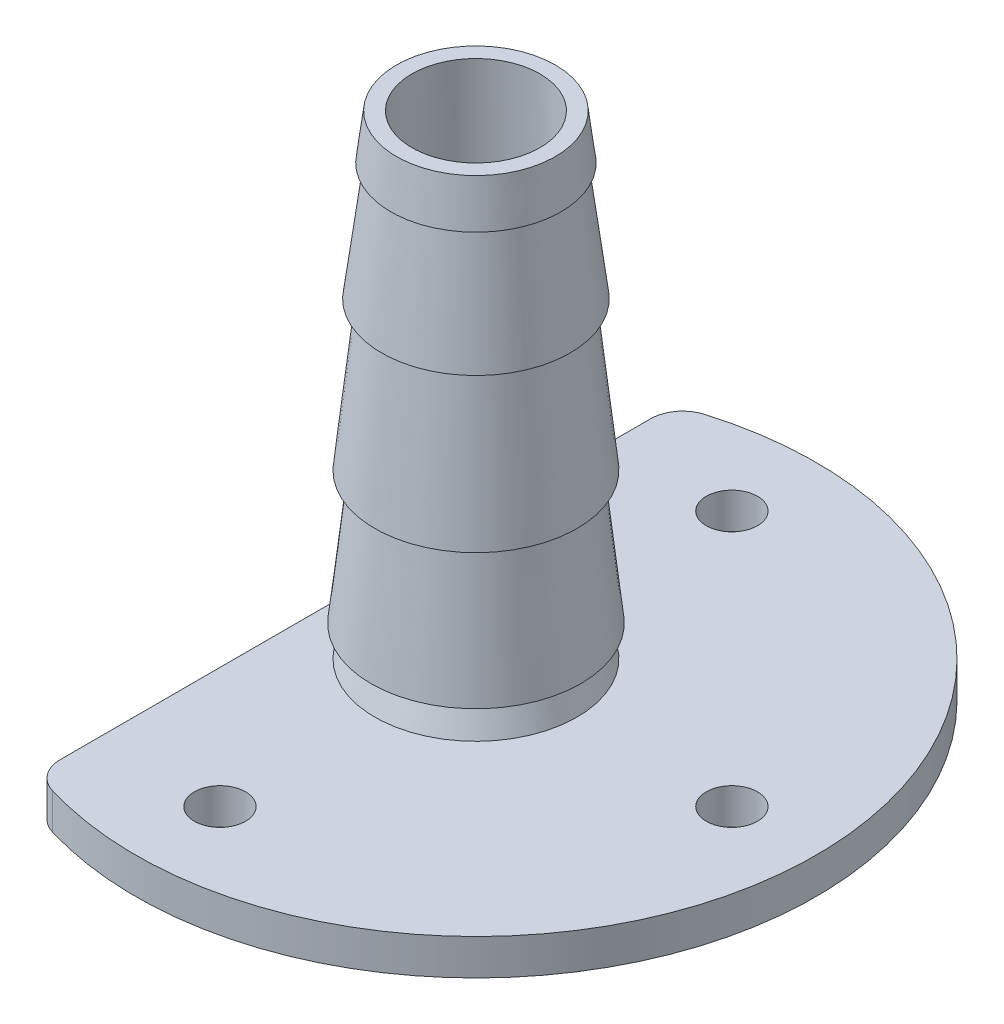
ISO-10303-21;
HEADER;
FILE_DESCRIPTION(('STEP AP214'),'2;1');
FILE_NAME('part.step','',(''),(''),'','','');
FILE_SCHEMA(('AUTOMOTIVE_DESIGN { 1 0 10303 214 1 1 1 1 }'));
ENDSEC;
DATA;
#1=APPLICATION_CONTEXT('core data for automotive mechanical design processes');
#2=APPLICATION_PROTOCOL_DEFINITION('international standard','automotive_design',2000,#1);
#3=PRODUCT_CONTEXT('',#1,'mechanical');
#4=PRODUCT('Part','Part','',(#3));
#5=PRODUCT_RELATED_PRODUCT_CATEGORY('part','',(#4));
#6=PRODUCT_DEFINITION_FORMATION('','',#4);
#7=PRODUCT_DEFINITION_CONTEXT('part definition',#1,'design');
#8=PRODUCT_DEFINITION('design','',#6,#7);
#9=PRODUCT_DEFINITION_SHAPE('','',#8);
#10=(LENGTH_UNIT() NAMED_UNIT(*) SI_UNIT(.MILLI.,.METRE.));
#11=(NAMED_UNIT(*) PLANE_ANGLE_UNIT() SI_UNIT($,.RADIAN.));
#12=(NAMED_UNIT(*) SI_UNIT($,.STERADIAN.) SOLID_ANGLE_UNIT());
#13=UNCERTAINTY_MEASURE_WITH_UNIT(LENGTH_MEASURE(1.E-05),#10,'distance_accuracy_value','');
#14=(GEOMETRIC_REPRESENTATION_CONTEXT(3) GLOBAL_UNCERTAINTY_ASSIGNED_CONTEXT((#13)) GLOBAL_UNIT_ASSIGNED_CONTEXT((#10,
#11,#12)) REPRESENTATION_CONTEXT('',''));
#15=CARTESIAN_POINT('',(0.,0.,0.));
#16=DIRECTION('',(0.,0.,1.));
#17=DIRECTION('',(1.,0.,0.));
#18=AXIS2_PLACEMENT_3D('',#15,#16,#17);
#19=CARTESIAN_POINT('',(0.,2.3212869367093,0.));
#20=DIRECTION('',(0.,-1.,0.));
#21=DIRECTION('',(0.,0.,-1.));
#22=AXIS2_PLACEMENT_3D('',#19,#20,#21);
#23=TOROIDAL_SURFACE('',#22,6.55682740154308,2.);
#24=CARTESIAN_POINT('',(0.,2.28379352676862,0.));
#25=DIRECTION('',(0.,-1.,0.));
#26=DIRECTION('',(0.,0.,-1.));
#27=AXIS2_PLACEMENT_3D('',#24,#25,#26);
#28=CIRCLE('',#27,4.55717887137309);
#29=CARTESIAN_POINT('',(0.,2.28379352676862,-4.55717887137309));
#30=VERTEX_POINT('',#29);
#31=EDGE_CURVE('E124',#30,#30,#28,.T.);
#32=ORIENTED_EDGE('',*,*,#31,.F.);
#33=EDGE_LOOP('',(#32));
#34=FACE_BOUND('',#33,.T.);
#35=CARTESIAN_POINT('',(0.,1.64561350948055,0.));
#36=DIRECTION('',(0.,-1.,0.));
#37=DIRECTION('',(0.,0.,-1.));
#38=AXIS2_PLACEMENT_3D('',#35,#36,#37);
#39=CIRCLE('',#38,4.67441792968609);
#40=CARTESIAN_POINT('',(0.,1.64561350948055,-4.67441792968609));
#41=VERTEX_POINT('',#40);
#42=EDGE_CURVE('E111',#41,#41,#39,.T.);
#43=ORIENTED_EDGE('',*,*,#42,.T.);
#44=EDGE_LOOP('',(#43));
#45=FACE_BOUND('',#44,.T.);
#46=ADVANCED_FACE('F38',(#34,#45),#23,.T.);
#47=CARTESIAN_POINT('',(0.,1.64561350948055,0.));
#48=DIRECTION('',(0.,-1.,0.));
#49=DIRECTION('',(0.,0.,-1.));
#50=AXIS2_PLACEMENT_3D('',#47,#48,#49);
#51=CONICAL_SURFACE('',#50,4.67441792968609,0.344617523861515);
#52=CARTESIAN_POINT('',(0.,0.,0.));
#53=DIRECTION('',(0.,-1.,0.));
#54=DIRECTION('',(0.,0.,-1.));
#55=AXIS2_PLACEMENT_3D('',#52,#53,#54);
#56=CIRCLE('',#55,5.26509564166538);
#57=CARTESIAN_POINT('',(0.,0.,-5.26509564166538));
#58=VERTEX_POINT('',#57);
#59=EDGE_CURVE('E102',#58,#58,#56,.T.);
#60=ORIENTED_EDGE('',*,*,#59,.T.);
#61=EDGE_LOOP('',(#60));
#62=FACE_BOUND('',#61,.T.);
#63=ORIENTED_EDGE('',*,*,#42,.F.);
#64=EDGE_LOOP('',(#63));
#65=FACE_BOUND('',#64,.T.);
#66=ADVANCED_FACE('F242',(#62,#65),#51,.F.);
#67=CARTESIAN_POINT('',(0.,0.,0.));
#68=DIRECTION('',(0.,-1.,0.));
#69=DIRECTION('',(0.,0.,-1.));
#70=AXIS2_PLACEMENT_3D('',#67,#68,#69);
#71=PLANE('',#70);
#72=DIRECTION('',(0.,0.,1.));
#73=VECTOR('',#72,1.);
#74=CARTESIAN_POINT('',(-7.53195416187687,0.,0.));
#75=LINE('',#74,#73);
#76=CARTESIAN_POINT('',(-7.53195416187687,0.,-18.4537636603867));
#77=VERTEX_POINT('',#76);
#78=CARTESIAN_POINT('',(-7.53195416187687,0.,18.4537636603867));
#79=VERTEX_POINT('',#78);
#80=EDGE_CURVE('E132',#77,#79,#75,.T.);
#81=ORIENTED_EDGE('',*,*,#80,.F.);
#82=CARTESIAN_POINT('',(-5.53195416187687,0.,-18.4537636603867));
#83=DIRECTION('',(0.,-1.,0.));
#84=DIRECTION('',(0.,0.,-1.));
#85=AXIS2_PLACEMENT_3D('',#82,#83,#84);
#86=CIRCLE('',#85,2.);
#87=CARTESIAN_POINT('',(-6.10625228785271,0.,-20.3695354793935));
#88=VERTEX_POINT('',#87);
#89=EDGE_CURVE('E11',#77,#88,#86,.T.);
#90=ORIENTED_EDGE('',*,*,#89,.T.);
#91=CARTESIAN_POINT('',(0.,0.,0.));
#92=DIRECTION('',(0.,-1.,0.));
#93=DIRECTION('',(0.,0.,-1.));
#94=AXIS2_PLACEMENT_3D('',#91,#92,#93);
#95=CIRCLE('',#94,21.2650956416654);
#96=CARTESIAN_POINT('',(-6.10625228785271,0.,20.3695354793935));
#97=VERTEX_POINT('',#96);
#98=EDGE_CURVE('E95',#88,#97,#95,.T.);
#99=ORIENTED_EDGE('',*,*,#98,.T.);
#100=CARTESIAN_POINT('',(-5.53195416187687,0.,18.4537636603867));
#101=DIRECTION('',(0.,-1.,0.));
#102=DIRECTION('',(0.,0.,-1.));
#103=AXIS2_PLACEMENT_3D('',#100,#101,#102);
#104=CIRCLE('',#103,2.);
#105=EDGE_CURVE('E46',#97,#79,#104,.T.);
#106=ORIENTED_EDGE('',*,*,#105,.T.);
#107=EDGE_LOOP('',(#81,#90,#99,#106));
#108=FACE_BOUND('',#107,.T.);
#109=CARTESIAN_POINT('',(0.,0.,-16.));
#110=DIRECTION('',(0.,-1.,0.));
#111=DIRECTION('',(0.,0.,-1.));
#112=AXIS2_PLACEMENT_3D('',#109,#110,#111);
#113=CIRCLE('',#112,1.6);
#114=CARTESIAN_POINT('',(0.,0.,-17.6));
#115=VERTEX_POINT('',#114);
#116=EDGE_CURVE('E118',#115,#115,#113,.T.);
#117=ORIENTED_EDGE('',*,*,#116,.F.);
#118=EDGE_LOOP('',(#117));
#119=FACE_BOUND('',#118,.T.);
#120=CARTESIAN_POINT('',(16.,0.,0.));
#121=DIRECTION('',(0.,-1.,0.));
#122=DIRECTION('',(0.,0.,-1.));
#123=AXIS2_PLACEMENT_3D('',#120,#121,#122);
#124=CIRCLE('',#123,1.6);
#125=CARTESIAN_POINT('',(16.,0.,-1.6));
#126=VERTEX_POINT('',#125);
#127=EDGE_CURVE('E140',#126,#126,#124,.T.);
#128=ORIENTED_EDGE('',*,*,#127,.F.);
#129=EDGE_LOOP('',(#128));
#130=FACE_BOUND('',#129,.T.);
#131=CARTESIAN_POINT('',(0.,0.,16.));
#132=DIRECTION('',(0.,-1.,0.));
#133=DIRECTION('',(0.,0.,-1.));
#134=AXIS2_PLACEMENT_3D('',#131,#132,#133);
#135=CIRCLE('',#134,1.6);
#136=CARTESIAN_POINT('',(0.,0.,14.4));
#137=VERTEX_POINT('',#136);
#138=EDGE_CURVE('E135',#137,#137,#135,.T.);
#139=ORIENTED_EDGE('',*,*,#138,.F.);
#140=EDGE_LOOP('',(#139));
#141=FACE_BOUND('',#140,.T.);
#142=ORIENTED_EDGE('',*,*,#59,.F.);
#143=EDGE_LOOP('',(#142));
#144=FACE_BOUND('',#143,.T.);
#145=ADVANCED_FACE('F247',(#108,#119,#130,#141,#144),#71,.T.);
#146=CARTESIAN_POINT('',(0.,0.,0.));
#147=DIRECTION('',(0.,-1.,0.));
#148=DIRECTION('',(0.,0.,-1.));
#149=AXIS2_PLACEMENT_3D('',#146,#147,#148);
#150=CYLINDRICAL_SURFACE('',#149,21.2650956416654);
#151=ORIENTED_EDGE('',*,*,#98,.F.);
#152=DIRECTION('',(0.,-1.,0.));
#153=VECTOR('',#152,1.);
#154=CARTESIAN_POINT('',(-6.10625228785271,0.,-20.3695354793935));
#155=LINE('',#154,#153);
#156=CARTESIAN_POINT('',(-6.10625228785271,2.24471932809196,-20.3695354793935));
#157=VERTEX_POINT('',#156);
#158=EDGE_CURVE('E82',#88,#157,#155,.F.);
#159=ORIENTED_EDGE('',*,*,#158,.T.);
#160=CARTESIAN_POINT('',(0.,2.24471932809196,0.));
#161=DIRECTION('',(0.,-1.,0.));
#162=DIRECTION('',(0.,0.,-1.));
#163=AXIS2_PLACEMENT_3D('',#160,#161,#162);
#164=CIRCLE('',#163,21.2650956416654);
#165=CARTESIAN_POINT('',(-6.10625228785271,2.24471932809196,20.3695354793935));
#166=VERTEX_POINT('',#165);
#167=EDGE_CURVE('E93',#157,#166,#164,.T.);
#168=ORIENTED_EDGE('',*,*,#167,.T.);
#169=DIRECTION('',(0.,-1.,0.));
#170=VECTOR('',#169,1.);
#171=CARTESIAN_POINT('',(-6.10625228785271,0.,20.3695354793935));
#172=LINE('',#171,#170);
#173=EDGE_CURVE('E96',#166,#97,#172,.T.);
#174=ORIENTED_EDGE('',*,*,#173,.T.);
#175=EDGE_LOOP('',(#151,#159,#168,#174));
#176=FACE_BOUND('',#175,.T.);
#177=ADVANCED_FACE('F92',(#176),#150,.T.);
#178=CARTESIAN_POINT('',(0.,2.24471932809196,0.));
#179=DIRECTION('',(0.,-1.,0.));
#180=DIRECTION('',(0.,0.,-1.));
#181=AXIS2_PLACEMENT_3D('',#178,#179,#180);
#182=PLANE('',#181);
#183=CARTESIAN_POINT('',(0.,2.24471932809196,-16.));
#184=DIRECTION('',(0.,-1.,0.));
#185=DIRECTION('',(0.,0.,-1.));
#186=AXIS2_PLACEMENT_3D('',#183,#184,#185);
#187=CIRCLE('',#186,1.6);
#188=CARTESIAN_POINT('',(0.,2.24471932809196,-17.6));
#189=VERTEX_POINT('',#188);
#190=EDGE_CURVE('E121',#189,#189,#187,.T.);
#191=ORIENTED_EDGE('',*,*,#190,.T.);
#192=EDGE_LOOP('',(#191));
#193=FACE_BOUND('',#192,.T.);
#194=CARTESIAN_POINT('',(16.,2.24471932809196,0.));
#195=DIRECTION('',(0.,-1.,0.));
#196=DIRECTION('',(0.,0.,-1.));
#197=AXIS2_PLACEMENT_3D('',#194,#195,#196);
#198=CIRCLE('',#197,1.6);
#199=CARTESIAN_POINT('',(16.,2.24471932809196,-1.6));
#200=VERTEX_POINT('',#199);
#201=EDGE_CURVE('E117',#200,#200,#198,.T.);
#202=ORIENTED_EDGE('',*,*,#201,.T.);
#203=EDGE_LOOP('',(#202));
#204=FACE_BOUND('',#203,.T.);
#205=CARTESIAN_POINT('',(0.,2.24471932809196,16.));
#206=DIRECTION('',(0.,-1.,0.));
#207=DIRECTION('',(0.,0.,-1.));
#208=AXIS2_PLACEMENT_3D('',#205,#206,#207);
#209=CIRCLE('',#208,1.6);
#210=CARTESIAN_POINT('',(0.,2.24471932809196,14.4));
#211=VERTEX_POINT('',#210);
#212=EDGE_CURVE('E114',#211,#211,#209,.T.);
#213=ORIENTED_EDGE('',*,*,#212,.T.);
#214=EDGE_LOOP('',(#213));
#215=FACE_BOUND('',#214,.T.);
#216=ORIENTED_EDGE('',*,*,#167,.F.);
#217=CARTESIAN_POINT('',(-5.53195416187687,2.24471932809196,-18.4537636603867));
#218=DIRECTION('',(0.,-1.,0.));
#219=DIRECTION('',(0.,0.,-1.));
#220=AXIS2_PLACEMENT_3D('',#217,#218,#219);
#221=CIRCLE('',#220,2.);
#222=CARTESIAN_POINT('',(-7.53195416187687,2.24471932809196,-18.4537636603867));
#223=VERTEX_POINT('',#222);
#224=EDGE_CURVE('E78',#157,#223,#221,.F.);
#225=ORIENTED_EDGE('',*,*,#224,.T.);
#226=DIRECTION('',(0.,0.,-1.));
#227=VECTOR('',#226,1.);
#228=CARTESIAN_POINT('',(-7.53195416187687,2.24471932809196,0.));
#229=LINE('',#228,#227);
#230=CARTESIAN_POINT('',(-7.53195416187687,2.24471932809196,18.4537636603867));
#231=VERTEX_POINT('',#230);
#232=EDGE_CURVE('E131',#231,#223,#229,.T.);
#233=ORIENTED_EDGE('',*,*,#232,.F.);
#234=CARTESIAN_POINT('',(-5.53195416187687,2.24471932809196,18.4537636603867));
#235=DIRECTION('',(0.,-1.,0.));
#236=DIRECTION('',(0.,0.,-1.));
#237=AXIS2_PLACEMENT_3D('',#234,#235,#236);
#238=CIRCLE('',#237,2.);
#239=EDGE_CURVE('E87',#231,#166,#238,.F.);
#240=ORIENTED_EDGE('',*,*,#239,.T.);
#241=EDGE_LOOP('',(#216,#225,#233,#240));
#242=FACE_BOUND('',#241,.T.);
#243=CARTESIAN_POINT('',(0.,2.24471932809197,0.));
#244=DIRECTION('',(0.,-1.,0.));
#245=DIRECTION('',(0.,0.,-1.));
#246=AXIS2_PLACEMENT_3D('',#243,#244,#245);
#247=CIRCLE('',#246,6.3218919043232);
#248=CARTESIAN_POINT('',(0.,2.24471932809197,-6.3218919043232));
#249=VERTEX_POINT('',#248);
#250=EDGE_CURVE('E100',#249,#249,#247,.T.);
#251=ORIENTED_EDGE('',*,*,#250,.T.);
#252=EDGE_LOOP('',(#251));
#253=FACE_BOUND('',#252,.T.);
#254=ADVANCED_FACE('F98',(#193,#204,#215,#242,#253),#182,.F.);
#255=CARTESIAN_POINT('',(0.,2.24471932809197,0.));
#256=DIRECTION('',(0.,-1.,0.));
#257=DIRECTION('',(0.,0.,-1.));
#258=AXIS2_PLACEMENT_3D('',#255,#256,#257);
#259=CONICAL_SURFACE('',#258,6.3218919043232,0.344617523861515);
#260=CARTESIAN_POINT('',(0.,4.1729538437778,0.));
#261=DIRECTION('',(0.,-1.,0.));
#262=DIRECTION('',(0.,0.,-1.));
#263=AXIS2_PLACEMENT_3D('',#260,#261,#262);
#264=CIRCLE('',#263,5.6297700024774);
#265=CARTESIAN_POINT('',(0.,4.1729538437778,-5.6297700024774));
#266=VERTEX_POINT('',#265);
#267=EDGE_CURVE('E105',#266,#266,#264,.T.);
#268=ORIENTED_EDGE('',*,*,#267,.T.);
#269=EDGE_LOOP('',(#268));
#270=FACE_BOUND('',#269,.T.);
#271=ORIENTED_EDGE('',*,*,#250,.F.);
#272=EDGE_LOOP('',(#271));
#273=FACE_BOUND('',#272,.T.);
#274=ADVANCED_FACE('F176',(#270,#273),#259,.T.);
#275=CARTESIAN_POINT('',(0.,4.1729538437778,0.));
#276=DIRECTION('',(0.,1.,0.));
#277=DIRECTION('',(0.,0.,1.));
#278=AXIS2_PLACEMENT_3D('',#275,#276,#277);
#279=PLANE('',#278);
#280=ORIENTED_EDGE('',*,*,#267,.F.);
#281=EDGE_LOOP('',(#280));
#282=FACE_BOUND('',#281,.T.);
#283=CARTESIAN_POINT('',(0.,4.17295384377781,0.));
#284=DIRECTION('',(0.,-1.,0.));
#285=DIRECTION('',(0.,0.,-1.));
#286=AXIS2_PLACEMENT_3D('',#283,#284,#285);
#287=CIRCLE('',#286,6.55682740154308);
#288=CARTESIAN_POINT('',(0.,4.17295384377781,-6.55682740154308));
#289=VERTEX_POINT('',#288);
#290=EDGE_CURVE('E171',#289,#289,#287,.T.);
#291=ORIENTED_EDGE('',*,*,#290,.T.);
#292=EDGE_LOOP('',(#291));
#293=FACE_BOUND('',#292,.T.);
#294=ADVANCED_FACE('F179',(#282,#293),#279,.F.);
#295=CARTESIAN_POINT('',(0.,12.4547190033297,0.));
#296=DIRECTION('',(0.,-1.,0.));
#297=DIRECTION('',(0.,0.,-1.));
#298=AXIS2_PLACEMENT_3D('',#295,#296,#297);
#299=CONICAL_SURFACE('',#298,5.65976778716726,0.107896781443388);
#300=ORIENTED_EDGE('',*,*,#290,.F.);
#301=EDGE_LOOP('',(#300));
#302=FACE_BOUND('',#301,.T.);
#303=CARTESIAN_POINT('',(0.,12.4547190033297,0.));
#304=DIRECTION('',(0.,-1.,0.));
#305=DIRECTION('',(0.,0.,-1.));
#306=AXIS2_PLACEMENT_3D('',#303,#304,#305);
#307=CIRCLE('',#306,5.65976778716726);
#308=CARTESIAN_POINT('',(0.,12.4547190033297,-5.65976778716726));
#309=VERTEX_POINT('',#308);
#310=EDGE_CURVE('E168',#309,#309,#307,.T.);
#311=ORIENTED_EDGE('',*,*,#310,.T.);
#312=EDGE_LOOP('',(#311));
#313=FACE_BOUND('',#312,.T.);
#314=ADVANCED_FACE('F182',(#302,#313),#299,.T.);
#315=CARTESIAN_POINT('',(0.,12.4547190033297,0.));
#316=DIRECTION('',(0.,1.,0.));
#317=DIRECTION('',(0.,0.,1.));
#318=AXIS2_PLACEMENT_3D('',#315,#316,#317);
#319=PLANE('',#318);
#320=ORIENTED_EDGE('',*,*,#310,.F.);
#321=EDGE_LOOP('',(#320));
#322=FACE_BOUND('',#321,.T.);
#323=CARTESIAN_POINT('',(0.,12.4547190033297,0.));
#324=DIRECTION('',(0.,-1.,0.));
#325=DIRECTION('',(0.,0.,-1.));
#326=AXIS2_PLACEMENT_3D('',#323,#324,#325);
#327=CIRCLE('',#326,6.3218919043232);
#328=CARTESIAN_POINT('',(0.,12.4547190033297,-6.3218919043232));
#329=VERTEX_POINT('',#328);
#330=EDGE_CURVE('E165',#329,#329,#327,.T.);
#331=ORIENTED_EDGE('',*,*,#330,.T.);
#332=EDGE_LOOP('',(#331));
#333=FACE_BOUND('',#332,.T.);
#334=ADVANCED_FACE('F188',(#322,#333),#319,.F.);
#335=CARTESIAN_POINT('',(0.,21.7432961677191,0.));
#336=DIRECTION('',(0.,-1.,0.));
#337=DIRECTION('',(0.,0.,-1.));
#338=AXIS2_PLACEMENT_3D('',#335,#336,#337);
#339=CONICAL_SURFACE('',#338,5.31577698936732,0.107896781443388);
#340=ORIENTED_EDGE('',*,*,#330,.F.);
#341=EDGE_LOOP('',(#340));
#342=FACE_BOUND('',#341,.T.);
#343=CARTESIAN_POINT('',(0.,21.7432961677191,0.));
#344=DIRECTION('',(0.,-1.,0.));
#345=DIRECTION('',(0.,0.,-1.));
#346=AXIS2_PLACEMENT_3D('',#343,#344,#345);
#347=CIRCLE('',#346,5.31577698936732);
#348=CARTESIAN_POINT('',(0.,21.7432961677191,-5.31577698936732));
#349=VERTEX_POINT('',#348);
#350=EDGE_CURVE('E162',#349,#349,#347,.T.);
#351=ORIENTED_EDGE('',*,*,#350,.T.);
#352=EDGE_LOOP('',(#351));
#353=FACE_BOUND('',#352,.T.);
#354=ADVANCED_FACE('F194',(#342,#353),#339,.T.);
#355=CARTESIAN_POINT('',(0.,21.7432961677191,0.));
#356=DIRECTION('',(0.,1.,0.));
#357=DIRECTION('',(0.,0.,1.));
#358=AXIS2_PLACEMENT_3D('',#355,#356,#357);
#359=PLANE('',#358);
#360=ORIENTED_EDGE('',*,*,#350,.F.);
#361=EDGE_LOOP('',(#360));
#362=FACE_BOUND('',#361,.T.);
#363=CARTESIAN_POINT('',(0.,21.7432961677191,0.));
#364=DIRECTION('',(0.,-1.,0.));
#365=DIRECTION('',(0.,0.,-1.));
#366=AXIS2_PLACEMENT_3D('',#363,#364,#365);
#367=CIRCLE('',#366,5.89459271066771);
#368=CARTESIAN_POINT('',(0.,21.7432961677191,-5.89459271066771));
#369=VERTEX_POINT('',#368);
#370=EDGE_CURVE('E159',#369,#369,#367,.T.);
#371=ORIENTED_EDGE('',*,*,#370,.T.);
#372=EDGE_LOOP('',(#371));
#373=FACE_BOUND('',#372,.T.);
#374=ADVANCED_FACE('F200',(#362,#373),#359,.F.);
#375=CARTESIAN_POINT('',(0.,29.0929548651068,0.));
#376=DIRECTION('',(0.,-1.,0.));
#377=DIRECTION('',(0.,0.,-1.));
#378=AXIS2_PLACEMENT_3D('',#375,#376,#377);
#379=CONICAL_SURFACE('',#378,4.9638840040026,0.125962463541907);
#380=ORIENTED_EDGE('',*,*,#370,.F.);
#381=EDGE_LOOP('',(#380));
#382=FACE_BOUND('',#381,.T.);
#383=CARTESIAN_POINT('',(0.,29.0929548651068,0.));
#384=DIRECTION('',(0.,-1.,0.));
#385=DIRECTION('',(0.,0.,-1.));
#386=AXIS2_PLACEMENT_3D('',#383,#384,#385);
#387=CIRCLE('',#386,4.9638840040026);
#388=CARTESIAN_POINT('',(0.,29.0929548651068,-4.9638840040026));
#389=VERTEX_POINT('',#388);
#390=EDGE_CURVE('E156',#389,#389,#387,.T.);
#391=ORIENTED_EDGE('',*,*,#390,.T.);
#392=EDGE_LOOP('',(#391));
#393=FACE_BOUND('',#392,.T.);
#394=ADVANCED_FACE('F206',(#382,#393),#379,.T.);
#395=CARTESIAN_POINT('',(0.,29.0929548651068,0.));
#396=DIRECTION('',(0.,1.,0.));
#397=DIRECTION('',(0.,0.,1.));
#398=AXIS2_PLACEMENT_3D('',#395,#396,#397);
#399=PLANE('',#398);
#400=ORIENTED_EDGE('',*,*,#390,.F.);
#401=EDGE_LOOP('',(#400));
#402=FACE_BOUND('',#401,.T.);
#403=CARTESIAN_POINT('',(0.,29.0929548651068,0.));
#404=DIRECTION('',(0.,-1.,0.));
#405=DIRECTION('',(0.,0.,-1.));
#406=AXIS2_PLACEMENT_3D('',#403,#404,#405);
#407=CIRCLE('',#406,5.31577698936732);
#408=CARTESIAN_POINT('',(0.,29.0929548651068,-5.31577698936732));
#409=VERTEX_POINT('',#408);
#410=EDGE_CURVE('E153',#409,#409,#407,.T.);
#411=ORIENTED_EDGE('',*,*,#410,.T.);
#412=EDGE_LOOP('',(#411));
#413=FACE_BOUND('',#412,.T.);
#414=ADVANCED_FACE('F212',(#402,#413),#399,.F.);
#415=CARTESIAN_POINT('',(0.,31.9095905335668,0.));
#416=DIRECTION('',(0.,-1.,0.));
#417=DIRECTION('',(0.,0.,-1.));
#418=AXIS2_PLACEMENT_3D('',#415,#416,#417);
#419=CONICAL_SURFACE('',#418,4.9638840040026,0.124289808313311);
#420=ORIENTED_EDGE('',*,*,#410,.F.);
#421=EDGE_LOOP('',(#420));
#422=FACE_BOUND('',#421,.T.);
#423=CARTESIAN_POINT('',(0.,31.9095905335668,0.));
#424=DIRECTION('',(0.,-1.,0.));
#425=DIRECTION('',(0.,0.,-1.));
#426=AXIS2_PLACEMENT_3D('',#423,#424,#425);
#427=CIRCLE('',#426,4.9638840040026);
#428=CARTESIAN_POINT('',(0.,31.9095905335668,-4.9638840040026));
#429=VERTEX_POINT('',#428);
#430=EDGE_CURVE('E150',#429,#429,#427,.T.);
#431=ORIENTED_EDGE('',*,*,#430,.T.);
#432=EDGE_LOOP('',(#431));
#433=FACE_BOUND('',#432,.T.);
#434=ADVANCED_FACE('F218',(#422,#433),#419,.T.);
#435=CARTESIAN_POINT('',(0.,31.9095905335668,0.));
#436=DIRECTION('',(0.,-1.,0.));
#437=DIRECTION('',(0.,0.,-1.));
#438=AXIS2_PLACEMENT_3D('',#435,#436,#437);
#439=PLANE('',#438);
#440=ORIENTED_EDGE('',*,*,#430,.F.);
#441=EDGE_LOOP('',(#440));
#442=FACE_BOUND('',#441,.T.);
#443=CARTESIAN_POINT('',(0.,31.9095905335668,0.));
#444=DIRECTION('',(0.,-1.,0.));
#445=DIRECTION('',(0.,0.,-1.));
#446=AXIS2_PLACEMENT_3D('',#443,#444,#445);
#447=CIRCLE('',#446,4.00169517749574);
#448=CARTESIAN_POINT('',(0.,31.9095905335668,-4.00169517749574));
#449=VERTEX_POINT('',#448);
#450=EDGE_CURVE('E147',#449,#449,#447,.T.);
#451=ORIENTED_EDGE('',*,*,#450,.T.);
#452=EDGE_LOOP('',(#451));
#453=FACE_BOUND('',#452,.T.);
#454=ADVANCED_FACE('F224',(#442,#453),#439,.F.);
#455=CARTESIAN_POINT('',(0.,2.28379352676862,0.));
#456=DIRECTION('',(0.,-1.,0.));
#457=DIRECTION('',(0.,0.,-1.));
#458=AXIS2_PLACEMENT_3D('',#455,#456,#457);
#459=CONICAL_SURFACE('',#458,4.55717887137309,0.0187478031977404);
#460=ORIENTED_EDGE('',*,*,#450,.F.);
#461=EDGE_LOOP('',(#460));
#462=FACE_BOUND('',#461,.T.);
#463=ORIENTED_EDGE('',*,*,#31,.T.);
#464=EDGE_LOOP('',(#463));
#465=FACE_BOUND('',#464,.T.);
#466=ADVANCED_FACE('F230',(#462,#465),#459,.F.);
#467=CARTESIAN_POINT('',(0.,10.,16.));
#468=DIRECTION('',(0.,-1.,0.));
#469=DIRECTION('',(0.,0.,-1.));
#470=AXIS2_PLACEMENT_3D('',#467,#468,#469);
#471=CYLINDRICAL_SURFACE('',#470,1.6);
#472=ORIENTED_EDGE('',*,*,#138,.T.);
#473=EDGE_LOOP('',(#472));
#474=FACE_BOUND('',#473,.T.);
#475=ORIENTED_EDGE('',*,*,#212,.F.);
#476=EDGE_LOOP('',(#475));
#477=FACE_BOUND('',#476,.T.);
#478=ADVANCED_FACE('F236',(#474,#477),#471,.F.);
#479=CARTESIAN_POINT('',(16.,10.,0.));
#480=DIRECTION('',(0.,-1.,0.));
#481=DIRECTION('',(0.,0.,-1.));
#482=AXIS2_PLACEMENT_3D('',#479,#480,#481);
#483=CYLINDRICAL_SURFACE('',#482,1.6);
#484=ORIENTED_EDGE('',*,*,#127,.T.);
#485=EDGE_LOOP('',(#484));
#486=FACE_BOUND('',#485,.T.);
#487=ORIENTED_EDGE('',*,*,#201,.F.);
#488=EDGE_LOOP('',(#487));
#489=FACE_BOUND('',#488,.T.);
#490=ADVANCED_FACE('F265',(#486,#489),#483,.F.);
#491=CARTESIAN_POINT('',(0.,10.,-16.));
#492=DIRECTION('',(0.,-1.,0.));
#493=DIRECTION('',(0.,0.,-1.));
#494=AXIS2_PLACEMENT_3D('',#491,#492,#493);
#495=CYLINDRICAL_SURFACE('',#494,1.6);
#496=ORIENTED_EDGE('',*,*,#116,.T.);
#497=EDGE_LOOP('',(#496));
#498=FACE_BOUND('',#497,.T.);
#499=ORIENTED_EDGE('',*,*,#190,.F.);
#500=EDGE_LOOP('',(#499));
#501=FACE_BOUND('',#500,.T.);
#502=ADVANCED_FACE('F260',(#498,#501),#495,.F.);
#503=CARTESIAN_POINT('',(-7.53195416187687,-7.75528067190804,0.));
#504=DIRECTION('',(1.,0.,0.));
#505=DIRECTION('',(0.,0.,-1.));
#506=AXIS2_PLACEMENT_3D('',#503,#504,#505);
#507=PLANE('',#506);
#508=ORIENTED_EDGE('',*,*,#232,.T.);
#509=DIRECTION('',(0.,-1.,0.));
#510=VECTOR('',#509,1.);
#511=CARTESIAN_POINT('',(-7.53195416187687,-7.75528067190804,-18.4537636603867));
#512=LINE('',#511,#510);
#513=EDGE_CURVE('E59',#223,#77,#512,.T.);
#514=ORIENTED_EDGE('',*,*,#513,.T.);
#515=ORIENTED_EDGE('',*,*,#80,.T.);
#516=DIRECTION('',(0.,-1.,0.));
#517=VECTOR('',#516,1.);
#518=CARTESIAN_POINT('',(-7.53195416187687,-7.75528067190804,18.4537636603867));
#519=LINE('',#518,#517);
#520=EDGE_CURVE('E86',#79,#231,#519,.F.);
#521=ORIENTED_EDGE('',*,*,#520,.T.);
#522=EDGE_LOOP('',(#508,#514,#515,#521));
#523=FACE_BOUND('',#522,.T.);
#524=ADVANCED_FACE('F130',(#523),#507,.F.);
#525=CARTESIAN_POINT('',(-5.53195416187687,0.,-18.4537636603867));
#526=DIRECTION('',(0.,-1.,0.));
#527=DIRECTION('',(0.,0.,-1.));
#528=AXIS2_PLACEMENT_3D('',#525,#526,#527);
#529=CYLINDRICAL_SURFACE('',#528,2.);
#530=ORIENTED_EDGE('',*,*,#89,.F.);
#531=ORIENTED_EDGE('',*,*,#513,.F.);
#532=ORIENTED_EDGE('',*,*,#224,.F.);
#533=ORIENTED_EDGE('',*,*,#158,.F.);
#534=EDGE_LOOP('',(#530,#531,#532,#533));
#535=FACE_BOUND('',#534,.T.);
#536=ADVANCED_FACE('F81',(#535),#529,.T.);
#537=CARTESIAN_POINT('',(-5.53195416187687,0.,18.4537636603867));
#538=DIRECTION('',(0.,-1.,0.));
#539=DIRECTION('',(0.,0.,-1.));
#540=AXIS2_PLACEMENT_3D('',#537,#538,#539);
#541=CYLINDRICAL_SURFACE('',#540,2.);
#542=ORIENTED_EDGE('',*,*,#105,.F.);
#543=ORIENTED_EDGE('',*,*,#173,.F.);
#544=ORIENTED_EDGE('',*,*,#239,.F.);
#545=ORIENTED_EDGE('',*,*,#520,.F.);
#546=EDGE_LOOP('',(#542,#543,#544,#545));
#547=FACE_BOUND('',#546,.T.);
#548=ADVANCED_FACE('F40',(#547),#541,.T.);
#549=CLOSED_SHELL('',(#46,#66,#145,#177,#254,#274,#294,#314,#334,#354,#374,#394,#414,#434,#454,
#466,#478,#490,#502,#524,#536,#548));
#550=MANIFOLD_SOLID_BREP('B2',#549);
#551=ADVANCED_BREP_SHAPE_REPRESENTATION('',(#18,#550),#14);
#552=SHAPE_DEFINITION_REPRESENTATION(#9,#551);
ENDSEC;
END-ISO-10303-21;
